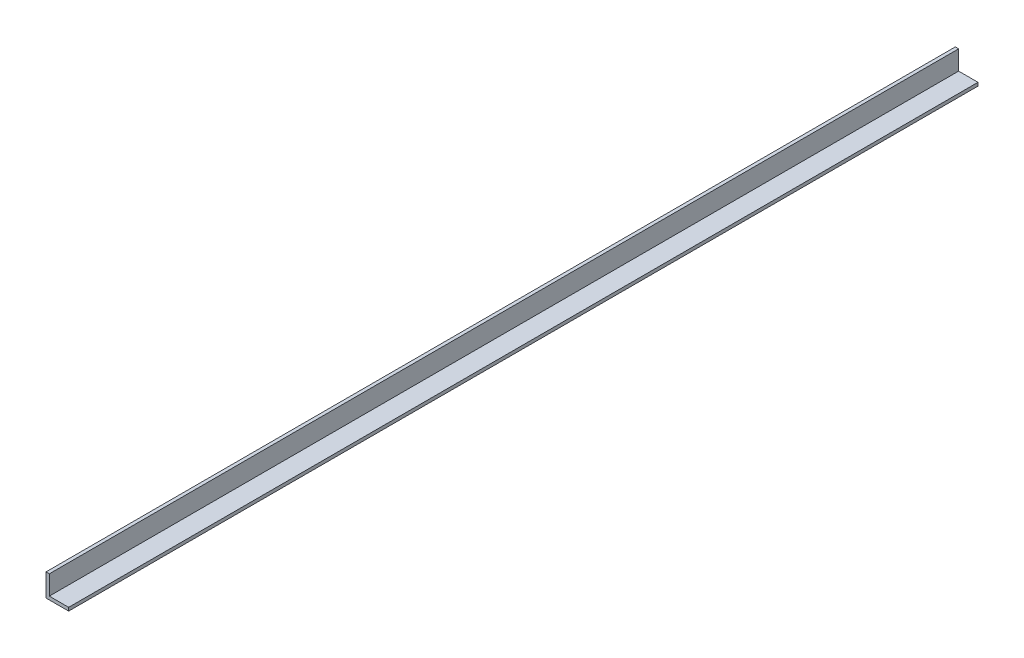
ISO-10303-21;
HEADER;
FILE_DESCRIPTION(('STEP AP214'),'2;1');
FILE_NAME('part.step','',(''),(''),'','','');
FILE_SCHEMA(('AUTOMOTIVE_DESIGN { 1 0 10303 214 1 1 1 1 }'));
ENDSEC;
DATA;
#1=APPLICATION_CONTEXT('core data for automotive mechanical design processes');
#2=APPLICATION_PROTOCOL_DEFINITION('international standard','automotive_design',2000,#1);
#3=PRODUCT_CONTEXT('',#1,'mechanical');
#4=PRODUCT('Part','Part','',(#3));
#5=PRODUCT_RELATED_PRODUCT_CATEGORY('part','',(#4));
#6=PRODUCT_DEFINITION_FORMATION('','',#4);
#7=PRODUCT_DEFINITION_CONTEXT('part definition',#1,'design');
#8=PRODUCT_DEFINITION('design','',#6,#7);
#9=PRODUCT_DEFINITION_SHAPE('','',#8);
#10=(LENGTH_UNIT() NAMED_UNIT(*) SI_UNIT(.MILLI.,.METRE.));
#11=(NAMED_UNIT(*) PLANE_ANGLE_UNIT() SI_UNIT($,.RADIAN.));
#12=(NAMED_UNIT(*) SI_UNIT($,.STERADIAN.) SOLID_ANGLE_UNIT());
#13=UNCERTAINTY_MEASURE_WITH_UNIT(LENGTH_MEASURE(1.E-05),#10,'distance_accuracy_value','');
#14=(GEOMETRIC_REPRESENTATION_CONTEXT(3) GLOBAL_UNCERTAINTY_ASSIGNED_CONTEXT((#13)) GLOBAL_UNIT_ASSIGNED_CONTEXT((#10,
#11,#12)) REPRESENTATION_CONTEXT('',''));
#15=CARTESIAN_POINT('',(0.,0.,0.));
#16=DIRECTION('',(0.,0.,1.));
#17=DIRECTION('',(1.,0.,0.));
#18=AXIS2_PLACEMENT_3D('',#15,#16,#17);
#19=CARTESIAN_POINT('',(22.23,152.,-6100.));
#20=DIRECTION('',(0.,1.,0.));
#21=DIRECTION('',(0.,0.,1.));
#22=AXIS2_PLACEMENT_3D('',#19,#20,#21);
#23=PLANE('',#22);
#24=DIRECTION('',(-1.,0.,0.));
#25=VECTOR('',#24,1.);
#26=CARTESIAN_POINT('',(22.23,152.,0.));
#27=LINE('',#26,#25);
#28=CARTESIAN_POINT('',(22.23,152.,0.));
#29=VERTEX_POINT('',#28);
#30=CARTESIAN_POINT('',(0.,152.,0.));
#31=VERTEX_POINT('',#30);
#32=EDGE_CURVE('E118',#29,#31,#27,.T.);
#33=ORIENTED_EDGE('',*,*,#32,.F.);
#34=DIRECTION('',(0.,0.,1.));
#35=VECTOR('',#34,1.);
#36=CARTESIAN_POINT('',(22.23,152.,-6100.));
#37=LINE('',#36,#35);
#38=CARTESIAN_POINT('',(22.23,152.,-6100.));
#39=VERTEX_POINT('',#38);
#40=EDGE_CURVE('E11',#39,#29,#37,.T.);
#41=ORIENTED_EDGE('',*,*,#40,.F.);
#42=DIRECTION('',(-1.,0.,0.));
#43=VECTOR('',#42,1.);
#44=CARTESIAN_POINT('',(22.23,152.,-6100.));
#45=LINE('',#44,#43);
#46=CARTESIAN_POINT('',(0.,152.,-6100.));
#47=VERTEX_POINT('',#46);
#48=EDGE_CURVE('E132',#39,#47,#45,.T.);
#49=ORIENTED_EDGE('',*,*,#48,.T.);
#50=DIRECTION('',(0.,0.,1.));
#51=VECTOR('',#50,1.);
#52=CARTESIAN_POINT('',(0.,152.,-6100.));
#53=LINE('',#52,#51);
#54=EDGE_CURVE('E36',#47,#31,#53,.T.);
#55=ORIENTED_EDGE('',*,*,#54,.T.);
#56=EDGE_LOOP('',(#33,#41,#49,#55));
#57=FACE_BOUND('',#56,.T.);
#58=ADVANCED_FACE('F33',(#57),#23,.T.);
#59=CARTESIAN_POINT('',(22.23,22.23,-6100.));
#60=DIRECTION('',(1.,0.,0.));
#61=DIRECTION('',(0.,1.,0.));
#62=AXIS2_PLACEMENT_3D('',#59,#60,#61);
#63=PLANE('',#62);
#64=DIRECTION('',(0.,1.,0.));
#65=VECTOR('',#64,1.);
#66=CARTESIAN_POINT('',(22.23,22.23,0.));
#67=LINE('',#66,#65);
#68=CARTESIAN_POINT('',(22.23,22.23,0.));
#69=VERTEX_POINT('',#68);
#70=EDGE_CURVE('E130',#69,#29,#67,.T.);
#71=ORIENTED_EDGE('',*,*,#70,.F.);
#72=DIRECTION('',(0.,0.,1.));
#73=VECTOR('',#72,1.);
#74=CARTESIAN_POINT('',(22.23,22.23,-6100.));
#75=LINE('',#74,#73);
#76=CARTESIAN_POINT('',(22.23,22.23,-6100.));
#77=VERTEX_POINT('',#76);
#78=EDGE_CURVE('E42',#77,#69,#75,.T.);
#79=ORIENTED_EDGE('',*,*,#78,.F.);
#80=DIRECTION('',(0.,1.,0.));
#81=VECTOR('',#80,1.);
#82=CARTESIAN_POINT('',(22.23,22.23,-6100.));
#83=LINE('',#82,#81);
#84=EDGE_CURVE('E108',#77,#39,#83,.T.);
#85=ORIENTED_EDGE('',*,*,#84,.T.);
#86=ORIENTED_EDGE('',*,*,#40,.T.);
#87=EDGE_LOOP('',(#71,#79,#85,#86));
#88=FACE_BOUND('',#87,.T.);
#89=ADVANCED_FACE('F140',(#88),#63,.T.);
#90=CARTESIAN_POINT('',(152.,22.23,-6100.));
#91=DIRECTION('',(0.,1.,0.));
#92=DIRECTION('',(-1.,0.,0.));
#93=AXIS2_PLACEMENT_3D('',#90,#91,#92);
#94=PLANE('',#93);
#95=DIRECTION('',(-1.,0.,0.));
#96=VECTOR('',#95,1.);
#97=CARTESIAN_POINT('',(152.,22.23,0.));
#98=LINE('',#97,#96);
#99=CARTESIAN_POINT('',(152.,22.23,0.));
#100=VERTEX_POINT('',#99);
#101=EDGE_CURVE('E95',#100,#69,#98,.T.);
#102=ORIENTED_EDGE('',*,*,#101,.F.);
#103=DIRECTION('',(0.,0.,1.));
#104=VECTOR('',#103,1.);
#105=CARTESIAN_POINT('',(152.,22.23,-6100.));
#106=LINE('',#105,#104);
#107=CARTESIAN_POINT('',(152.,22.23,-6100.));
#108=VERTEX_POINT('',#107);
#109=EDGE_CURVE('E90',#108,#100,#106,.T.);
#110=ORIENTED_EDGE('',*,*,#109,.F.);
#111=DIRECTION('',(-1.,0.,0.));
#112=VECTOR('',#111,1.);
#113=CARTESIAN_POINT('',(152.,22.23,-6100.));
#114=LINE('',#113,#112);
#115=EDGE_CURVE('E93',#108,#77,#114,.T.);
#116=ORIENTED_EDGE('',*,*,#115,.T.);
#117=ORIENTED_EDGE('',*,*,#78,.T.);
#118=EDGE_LOOP('',(#102,#110,#116,#117));
#119=FACE_BOUND('',#118,.T.);
#120=ADVANCED_FACE('F92',(#119),#94,.T.);
#121=CARTESIAN_POINT('',(152.,0.,-6100.));
#122=DIRECTION('',(1.,0.,0.));
#123=DIRECTION('',(0.,0.,-1.));
#124=AXIS2_PLACEMENT_3D('',#121,#122,#123);
#125=PLANE('',#124);
#126=DIRECTION('',(0.,1.,0.));
#127=VECTOR('',#126,1.);
#128=CARTESIAN_POINT('',(152.,0.,0.));
#129=LINE('',#128,#127);
#130=CARTESIAN_POINT('',(152.,0.,0.));
#131=VERTEX_POINT('',#130);
#132=EDGE_CURVE('E127',#131,#100,#129,.T.);
#133=ORIENTED_EDGE('',*,*,#132,.F.);
#134=DIRECTION('',(0.,0.,1.));
#135=VECTOR('',#134,1.);
#136=CARTESIAN_POINT('',(152.,0.,-6100.));
#137=LINE('',#136,#135);
#138=CARTESIAN_POINT('',(152.,0.,-6100.));
#139=VERTEX_POINT('',#138);
#140=EDGE_CURVE('E100',#139,#131,#137,.T.);
#141=ORIENTED_EDGE('',*,*,#140,.F.);
#142=DIRECTION('',(0.,1.,0.));
#143=VECTOR('',#142,1.);
#144=CARTESIAN_POINT('',(152.,0.,-6100.));
#145=LINE('',#144,#143);
#146=EDGE_CURVE('E106',#139,#108,#145,.T.);
#147=ORIENTED_EDGE('',*,*,#146,.T.);
#148=ORIENTED_EDGE('',*,*,#109,.T.);
#149=EDGE_LOOP('',(#133,#141,#147,#148));
#150=FACE_BOUND('',#149,.T.);
#151=ADVANCED_FACE('F110',(#150),#125,.T.);
#152=CARTESIAN_POINT('',(0.,0.,-6100.));
#153=DIRECTION('',(0.,-1.,0.));
#154=DIRECTION('',(0.,0.,-1.));
#155=AXIS2_PLACEMENT_3D('',#152,#153,#154);
#156=PLANE('',#155);
#157=DIRECTION('',(1.,0.,0.));
#158=VECTOR('',#157,1.);
#159=CARTESIAN_POINT('',(0.,0.,0.));
#160=LINE('',#159,#158);
#161=CARTESIAN_POINT('',(0.,0.,0.));
#162=VERTEX_POINT('',#161);
#163=EDGE_CURVE('E124',#162,#131,#160,.T.);
#164=ORIENTED_EDGE('',*,*,#163,.F.);
#165=DIRECTION('',(0.,0.,1.));
#166=VECTOR('',#165,1.);
#167=CARTESIAN_POINT('',(0.,0.,-6100.));
#168=LINE('',#167,#166);
#169=CARTESIAN_POINT('',(0.,0.,-6100.));
#170=VERTEX_POINT('',#169);
#171=EDGE_CURVE('E135',#170,#162,#168,.T.);
#172=ORIENTED_EDGE('',*,*,#171,.F.);
#173=DIRECTION('',(1.,0.,0.));
#174=VECTOR('',#173,1.);
#175=CARTESIAN_POINT('',(0.,0.,-6100.));
#176=LINE('',#175,#174);
#177=EDGE_CURVE('E111',#170,#139,#176,.T.);
#178=ORIENTED_EDGE('',*,*,#177,.T.);
#179=ORIENTED_EDGE('',*,*,#140,.T.);
#180=EDGE_LOOP('',(#164,#172,#178,#179));
#181=FACE_BOUND('',#180,.T.);
#182=ADVANCED_FACE('F153',(#181),#156,.T.);
#183=CARTESIAN_POINT('',(0.,152.,-6100.));
#184=DIRECTION('',(-1.,0.,0.));
#185=DIRECTION('',(0.,-1.,0.));
#186=AXIS2_PLACEMENT_3D('',#183,#184,#185);
#187=PLANE('',#186);
#188=DIRECTION('',(0.,-1.,0.));
#189=VECTOR('',#188,1.);
#190=CARTESIAN_POINT('',(0.,152.,0.));
#191=LINE('',#190,#189);
#192=EDGE_CURVE('E121',#31,#162,#191,.T.);
#193=ORIENTED_EDGE('',*,*,#192,.F.);
#194=ORIENTED_EDGE('',*,*,#54,.F.);
#195=DIRECTION('',(0.,-1.,0.));
#196=VECTOR('',#195,1.);
#197=CARTESIAN_POINT('',(0.,152.,-6100.));
#198=LINE('',#197,#196);
#199=EDGE_CURVE('E113',#47,#170,#198,.T.);
#200=ORIENTED_EDGE('',*,*,#199,.T.);
#201=ORIENTED_EDGE('',*,*,#171,.T.);
#202=EDGE_LOOP('',(#193,#194,#200,#201));
#203=FACE_BOUND('',#202,.T.);
#204=ADVANCED_FACE('F137',(#203),#187,.T.);
#205=CARTESIAN_POINT('',(0.,0.,-6100.));
#206=DIRECTION('',(0.,0.,1.));
#207=DIRECTION('',(1.,0.,0.));
#208=AXIS2_PLACEMENT_3D('',#205,#206,#207);
#209=PLANE('',#208);
#210=ORIENTED_EDGE('',*,*,#48,.F.);
#211=ORIENTED_EDGE('',*,*,#84,.F.);
#212=ORIENTED_EDGE('',*,*,#115,.F.);
#213=ORIENTED_EDGE('',*,*,#146,.F.);
#214=ORIENTED_EDGE('',*,*,#177,.F.);
#215=ORIENTED_EDGE('',*,*,#199,.F.);
#216=EDGE_LOOP('',(#210,#211,#212,#213,#214,#215));
#217=FACE_BOUND('',#216,.T.);
#218=ADVANCED_FACE('F104',(#217),#209,.F.);
#219=CARTESIAN_POINT('',(0.,0.,0.));
#220=DIRECTION('',(0.,0.,1.));
#221=DIRECTION('',(1.,0.,0.));
#222=AXIS2_PLACEMENT_3D('',#219,#220,#221);
#223=PLANE('',#222);
#224=ORIENTED_EDGE('',*,*,#32,.T.);
#225=ORIENTED_EDGE('',*,*,#192,.T.);
#226=ORIENTED_EDGE('',*,*,#163,.T.);
#227=ORIENTED_EDGE('',*,*,#132,.T.);
#228=ORIENTED_EDGE('',*,*,#101,.T.);
#229=ORIENTED_EDGE('',*,*,#70,.T.);
#230=EDGE_LOOP('',(#224,#225,#226,#227,#228,#229));
#231=FACE_BOUND('',#230,.T.);
#232=ADVANCED_FACE('F139',(#231),#223,.T.);
#233=CLOSED_SHELL('',(#58,#89,#120,#151,#182,#204,#218,#232));
#234=MANIFOLD_SOLID_BREP('B2',#233);
#235=ADVANCED_BREP_SHAPE_REPRESENTATION('',(#18,#234),#14);
#236=SHAPE_DEFINITION_REPRESENTATION(#9,#235);
ENDSEC;
END-ISO-10303-21;
